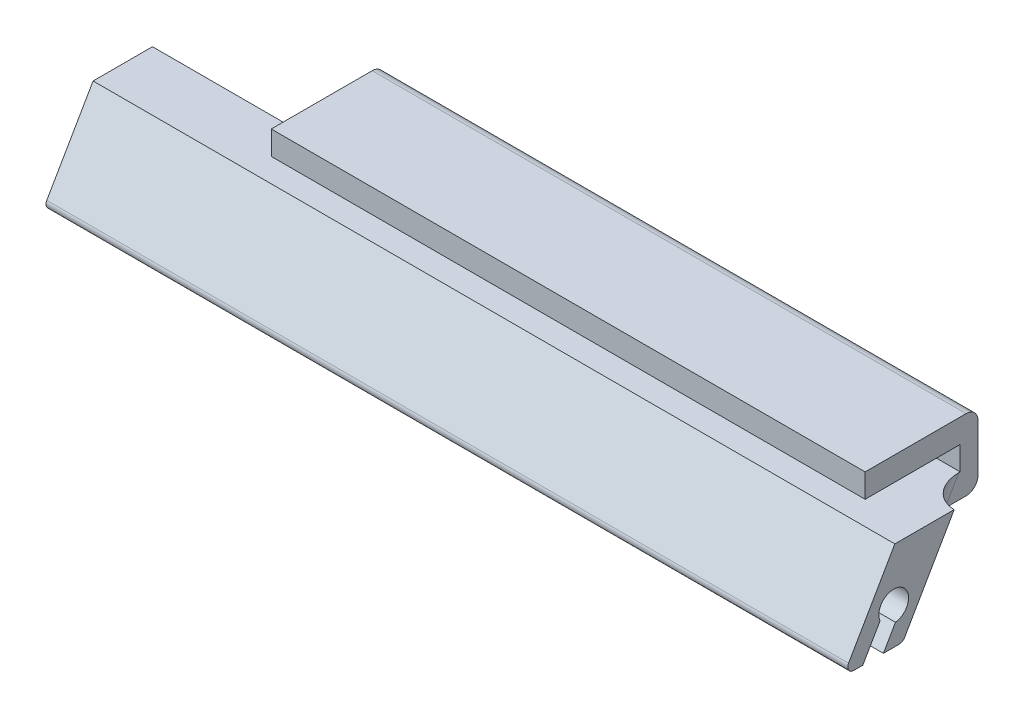
ISO-10303-21;
HEADER;
FILE_DESCRIPTION(('STEP AP214'),'2;1');
FILE_NAME('part.step','',(''),(''),'','','');
FILE_SCHEMA(('AUTOMOTIVE_DESIGN { 1 0 10303 214 1 1 1 1 }'));
ENDSEC;
DATA;
#1=APPLICATION_CONTEXT('core data for automotive mechanical design processes');
#2=APPLICATION_PROTOCOL_DEFINITION('international standard','automotive_design',2000,#1);
#3=PRODUCT_CONTEXT('',#1,'mechanical');
#4=PRODUCT('Part','Part','',(#3));
#5=PRODUCT_RELATED_PRODUCT_CATEGORY('part','',(#4));
#6=PRODUCT_DEFINITION_FORMATION('','',#4);
#7=PRODUCT_DEFINITION_CONTEXT('part definition',#1,'design');
#8=PRODUCT_DEFINITION('design','',#6,#7);
#9=PRODUCT_DEFINITION_SHAPE('','',#8);
#10=(LENGTH_UNIT() NAMED_UNIT(*) SI_UNIT(.MILLI.,.METRE.));
#11=(NAMED_UNIT(*) PLANE_ANGLE_UNIT() SI_UNIT($,.RADIAN.));
#12=(NAMED_UNIT(*) SI_UNIT($,.STERADIAN.) SOLID_ANGLE_UNIT());
#13=UNCERTAINTY_MEASURE_WITH_UNIT(LENGTH_MEASURE(1.E-05),#10,'distance_accuracy_value','');
#14=(GEOMETRIC_REPRESENTATION_CONTEXT(3) GLOBAL_UNCERTAINTY_ASSIGNED_CONTEXT((#13)) GLOBAL_UNIT_ASSIGNED_CONTEXT((#10,
#11,#12)) REPRESENTATION_CONTEXT('',''));
#15=CARTESIAN_POINT('',(0.,0.,0.));
#16=DIRECTION('',(0.,0.,1.));
#17=DIRECTION('',(1.,0.,0.));
#18=AXIS2_PLACEMENT_3D('',#15,#16,#17);
#19=CARTESIAN_POINT('',(100.,0.,0.));
#20=DIRECTION('',(1.,0.,0.));
#21=DIRECTION('',(0.,0.,-1.));
#22=AXIS2_PLACEMENT_3D('',#19,#20,#21);
#23=PLANE('',#22);
#24=DIRECTION('',(0.,1.,0.));
#25=VECTOR('',#24,1.);
#26=CARTESIAN_POINT('',(100.,0.,-27.6602540378444));
#27=LINE('',#26,#25);
#28=CARTESIAN_POINT('',(100.,13.,-27.6602540378444));
#29=VERTEX_POINT('',#28);
#30=CARTESIAN_POINT('',(100.,21.,-27.6602540378444));
#31=VERTEX_POINT('',#30);
#32=EDGE_CURVE('E339',#29,#31,#27,.T.);
#33=ORIENTED_EDGE('',*,*,#32,.T.);
#34=CARTESIAN_POINT('',(100.,21.,-25.6602540378444));
#35=DIRECTION('',(1.,0.,0.));
#36=DIRECTION('',(0.,0.,-1.));
#37=AXIS2_PLACEMENT_3D('',#34,#35,#36);
#38=CIRCLE('',#37,2.);
#39=CARTESIAN_POINT('',(100.,23.,-25.6602540378444));
#40=VERTEX_POINT('',#39);
#41=EDGE_CURVE('E250',#31,#40,#38,.T.);
#42=ORIENTED_EDGE('',*,*,#41,.T.);
#43=DIRECTION('',(0.,0.,1.));
#44=VECTOR('',#43,1.);
#45=CARTESIAN_POINT('',(100.,23.,0.));
#46=LINE('',#45,#44);
#47=CARTESIAN_POINT('',(100.,23.,-8.66025403784441));
#48=VERTEX_POINT('',#47);
#49=EDGE_CURVE('E343',#40,#48,#46,.T.);
#50=ORIENTED_EDGE('',*,*,#49,.T.);
#51=DIRECTION('',(0.,1.,0.));
#52=VECTOR('',#51,1.);
#53=CARTESIAN_POINT('',(100.,0.,-8.66025403784441));
#54=LINE('',#53,#52);
#55=CARTESIAN_POINT('',(100.,19.,-8.66025403784441));
#56=VERTEX_POINT('',#55);
#57=EDGE_CURVE('E319',#56,#48,#54,.T.);
#58=ORIENTED_EDGE('',*,*,#57,.F.);
#59=DIRECTION('',(0.,0.,1.));
#60=VECTOR('',#59,1.);
#61=CARTESIAN_POINT('',(100.,19.,0.));
#62=LINE('',#61,#60);
#63=CARTESIAN_POINT('',(100.,19.,-24.6602540378444));
#64=VERTEX_POINT('',#63);
#65=EDGE_CURVE('E323',#64,#56,#62,.T.);
#66=ORIENTED_EDGE('',*,*,#65,.F.);
#67=DIRECTION('',(0.,1.,0.));
#68=VECTOR('',#67,1.);
#69=CARTESIAN_POINT('',(100.,0.,-24.6602540378444));
#70=LINE('',#69,#68);
#71=CARTESIAN_POINT('',(100.,15.,-24.6602540378444));
#72=VERTEX_POINT('',#71);
#73=EDGE_CURVE('E328',#72,#64,#70,.T.);
#74=ORIENTED_EDGE('',*,*,#73,.F.);
#75=DIRECTION('',(0.,0.,-1.));
#76=VECTOR('',#75,1.);
#77=CARTESIAN_POINT('',(100.,15.,0.));
#78=LINE('',#77,#76);
#79=CARTESIAN_POINT('',(100.,15.,-24.4337567297407));
#80=VERTEX_POINT('',#79);
#81=EDGE_CURVE('E332',#80,#72,#78,.T.);
#82=ORIENTED_EDGE('',*,*,#81,.F.);
#83=DIRECTION('',(0.,-0.866025403784438,0.500000000000001));
#84=VECTOR('',#83,1.);
#85=CARTESIAN_POINT('',(100.,3.5,-17.79422863406));
#86=LINE('',#85,#84);
#87=CARTESIAN_POINT('',(100.,11.,-22.1243556529822));
#88=VERTEX_POINT('',#87);
#89=EDGE_CURVE('E214',#80,#88,#86,.T.);
#90=ORIENTED_EDGE('',*,*,#89,.T.);
#91=DIRECTION('',(0.,0.,-1.));
#92=VECTOR('',#91,1.);
#93=CARTESIAN_POINT('',(100.,11.,0.));
#94=LINE('',#93,#92);
#95=CARTESIAN_POINT('',(100.,11.,-25.6602540378444));
#96=VERTEX_POINT('',#95);
#97=EDGE_CURVE('E335',#88,#96,#94,.T.);
#98=ORIENTED_EDGE('',*,*,#97,.T.);
#99=CARTESIAN_POINT('',(100.,13.,-25.6602540378444));
#100=DIRECTION('',(1.,0.,0.));
#101=DIRECTION('',(0.,0.,-1.));
#102=AXIS2_PLACEMENT_3D('',#99,#100,#101);
#103=CIRCLE('',#102,2.);
#104=EDGE_CURVE('E247',#96,#29,#103,.T.);
#105=ORIENTED_EDGE('',*,*,#104,.T.);
#106=EDGE_LOOP('',(#33,#42,#50,#58,#66,#74,#82,#90,#98,#105));
#107=FACE_BOUND('',#106,.T.);
#108=ADVANCED_FACE('F44',(#107),#23,.T.);
#109=CARTESIAN_POINT('',(0.,0.,0.));
#110=DIRECTION('',(1.,0.,0.));
#111=DIRECTION('',(0.,0.,-1.));
#112=AXIS2_PLACEMENT_3D('',#109,#110,#111);
#113=PLANE('',#112);
#114=DIRECTION('',(0.,0.,1.));
#115=VECTOR('',#114,1.);
#116=CARTESIAN_POINT('',(0.,23.,0.));
#117=LINE('',#116,#115);
#118=CARTESIAN_POINT('',(0.,23.,-25.6602540378444));
#119=VERTEX_POINT('',#118);
#120=CARTESIAN_POINT('',(0.,23.,-8.66025403784441));
#121=VERTEX_POINT('',#120);
#122=EDGE_CURVE('E324',#119,#121,#117,.T.);
#123=ORIENTED_EDGE('',*,*,#122,.F.);
#124=CARTESIAN_POINT('',(0.,21.,-25.6602540378444));
#125=DIRECTION('',(1.,0.,0.));
#126=DIRECTION('',(0.,0.,-1.));
#127=AXIS2_PLACEMENT_3D('',#124,#125,#126);
#128=CIRCLE('',#127,2.);
#129=CARTESIAN_POINT('',(0.,21.,-27.6602540378444));
#130=VERTEX_POINT('',#129);
#131=EDGE_CURVE('E237',#119,#130,#128,.F.);
#132=ORIENTED_EDGE('',*,*,#131,.T.);
#133=DIRECTION('',(0.,1.,0.));
#134=VECTOR('',#133,1.);
#135=CARTESIAN_POINT('',(0.,0.,-27.6602540378444));
#136=LINE('',#135,#134);
#137=CARTESIAN_POINT('',(0.,13.,-27.6602540378444));
#138=VERTEX_POINT('',#137);
#139=EDGE_CURVE('E365',#138,#130,#136,.T.);
#140=ORIENTED_EDGE('',*,*,#139,.F.);
#141=CARTESIAN_POINT('',(0.,13.,-25.6602540378444));
#142=DIRECTION('',(1.,0.,0.));
#143=DIRECTION('',(0.,0.,-1.));
#144=AXIS2_PLACEMENT_3D('',#141,#142,#143);
#145=CIRCLE('',#144,2.);
#146=CARTESIAN_POINT('',(0.,11.,-25.6602540378444));
#147=VERTEX_POINT('',#146);
#148=EDGE_CURVE('E222',#138,#147,#145,.F.);
#149=ORIENTED_EDGE('',*,*,#148,.T.);
#150=DIRECTION('',(0.,0.,-1.));
#151=VECTOR('',#150,1.);
#152=CARTESIAN_POINT('',(0.,11.,0.));
#153=LINE('',#152,#151);
#154=CARTESIAN_POINT('',(0.,11.,-22.1243556529822));
#155=VERTEX_POINT('',#154);
#156=EDGE_CURVE('E361',#155,#147,#153,.T.);
#157=ORIENTED_EDGE('',*,*,#156,.F.);
#158=DIRECTION('',(0.,-0.866025403784438,0.500000000000001));
#159=VECTOR('',#158,1.);
#160=CARTESIAN_POINT('',(0.,-6.8301270189222,-11.8301270189222));
#161=LINE('',#160,#159);
#162=CARTESIAN_POINT('',(0.,15.,-24.4337567297407));
#163=VERTEX_POINT('',#162);
#164=EDGE_CURVE('E409',#155,#163,#161,.F.);
#165=ORIENTED_EDGE('',*,*,#164,.T.);
#166=DIRECTION('',(0.,0.,-1.));
#167=VECTOR('',#166,1.);
#168=CARTESIAN_POINT('',(0.,15.,0.));
#169=LINE('',#168,#167);
#170=CARTESIAN_POINT('',(0.,15.,-24.6602540378444));
#171=VERTEX_POINT('',#170);
#172=EDGE_CURVE('E358',#163,#171,#169,.T.);
#173=ORIENTED_EDGE('',*,*,#172,.T.);
#174=DIRECTION('',(0.,1.,0.));
#175=VECTOR('',#174,1.);
#176=CARTESIAN_POINT('',(0.,0.,-24.6602540378444));
#177=LINE('',#176,#175);
#178=CARTESIAN_POINT('',(0.,19.,-24.6602540378444));
#179=VERTEX_POINT('',#178);
#180=EDGE_CURVE('E354',#171,#179,#177,.T.);
#181=ORIENTED_EDGE('',*,*,#180,.T.);
#182=DIRECTION('',(0.,0.,1.));
#183=VECTOR('',#182,1.);
#184=CARTESIAN_POINT('',(0.,19.,0.));
#185=LINE('',#184,#183);
#186=CARTESIAN_POINT('',(0.,19.,-8.66025403784441));
#187=VERTEX_POINT('',#186);
#188=EDGE_CURVE('E350',#179,#187,#185,.T.);
#189=ORIENTED_EDGE('',*,*,#188,.T.);
#190=DIRECTION('',(0.,1.,0.));
#191=VECTOR('',#190,1.);
#192=CARTESIAN_POINT('',(0.,0.,-8.66025403784441));
#193=LINE('',#192,#191);
#194=EDGE_CURVE('E318',#187,#121,#193,.T.);
#195=ORIENTED_EDGE('',*,*,#194,.T.);
#196=EDGE_LOOP('',(#123,#132,#140,#149,#157,#165,#173,#181,#189,#195));
#197=FACE_BOUND('',#196,.T.);
#198=ADVANCED_FACE('F433',(#197),#113,.F.);
#199=CARTESIAN_POINT('',(100.,0.,-8.66025403784441));
#200=DIRECTION('',(0.,0.,1.));
#201=DIRECTION('',(1.,0.,0.));
#202=AXIS2_PLACEMENT_3D('',#199,#200,#201);
#203=PLANE('',#202);
#204=ORIENTED_EDGE('',*,*,#194,.F.);
#205=DIRECTION('',(-1.,0.,0.));
#206=VECTOR('',#205,1.);
#207=CARTESIAN_POINT('',(100.,19.,-8.66025403784441));
#208=LINE('',#207,#206);
#209=EDGE_CURVE('E395',#56,#187,#208,.T.);
#210=ORIENTED_EDGE('',*,*,#209,.F.);
#211=ORIENTED_EDGE('',*,*,#57,.T.);
#212=DIRECTION('',(-1.,0.,0.));
#213=VECTOR('',#212,1.);
#214=CARTESIAN_POINT('',(100.,23.,-8.66025403784441));
#215=LINE('',#214,#213);
#216=EDGE_CURVE('E346',#48,#121,#215,.T.);
#217=ORIENTED_EDGE('',*,*,#216,.T.);
#218=EDGE_LOOP('',(#204,#210,#211,#217));
#219=FACE_BOUND('',#218,.T.);
#220=ADVANCED_FACE('F428',(#219),#203,.T.);
#221=CARTESIAN_POINT('',(100.,19.,0.));
#222=DIRECTION('',(0.,-1.,0.));
#223=DIRECTION('',(0.,0.,-1.));
#224=AXIS2_PLACEMENT_3D('',#221,#222,#223);
#225=PLANE('',#224);
#226=ORIENTED_EDGE('',*,*,#188,.F.);
#227=DIRECTION('',(-1.,0.,0.));
#228=VECTOR('',#227,1.);
#229=CARTESIAN_POINT('',(100.,19.,-24.6602540378444));
#230=LINE('',#229,#228);
#231=EDGE_CURVE('E392',#64,#179,#230,.T.);
#232=ORIENTED_EDGE('',*,*,#231,.F.);
#233=ORIENTED_EDGE('',*,*,#65,.T.);
#234=ORIENTED_EDGE('',*,*,#209,.T.);
#235=EDGE_LOOP('',(#226,#232,#233,#234));
#236=FACE_BOUND('',#235,.T.);
#237=ADVANCED_FACE('F432',(#236),#225,.T.);
#238=CARTESIAN_POINT('',(100.,0.,-24.6602540378444));
#239=DIRECTION('',(0.,0.,1.));
#240=DIRECTION('',(1.,0.,0.));
#241=AXIS2_PLACEMENT_3D('',#238,#239,#240);
#242=PLANE('',#241);
#243=ORIENTED_EDGE('',*,*,#180,.F.);
#244=DIRECTION('',(-1.,0.,0.));
#245=VECTOR('',#244,1.);
#246=CARTESIAN_POINT('',(100.,15.,-24.6602540378444));
#247=LINE('',#246,#245);
#248=EDGE_CURVE('E388',#72,#171,#247,.T.);
#249=ORIENTED_EDGE('',*,*,#248,.F.);
#250=ORIENTED_EDGE('',*,*,#73,.T.);
#251=ORIENTED_EDGE('',*,*,#231,.T.);
#252=EDGE_LOOP('',(#243,#249,#250,#251));
#253=FACE_BOUND('',#252,.T.);
#254=ADVANCED_FACE('F437',(#253),#242,.T.);
#255=CARTESIAN_POINT('',(100.,15.,0.));
#256=DIRECTION('',(0.,1.,0.));
#257=DIRECTION('',(0.,0.,1.));
#258=AXIS2_PLACEMENT_3D('',#255,#256,#257);
#259=PLANE('',#258);
#260=DIRECTION('',(0.,0.,1.));
#261=VECTOR('',#260,1.);
#262=CARTESIAN_POINT('',(105.,15.,0.));
#263=LINE('',#262,#261);
#264=CARTESIAN_POINT('',(105.,15.,-18.6602540378444));
#265=VERTEX_POINT('',#264);
#266=CARTESIAN_POINT('',(105.,15.,-8.66025403784441));
#267=VERTEX_POINT('',#266);
#268=EDGE_CURVE('E190',#265,#267,#263,.T.);
#269=ORIENTED_EDGE('',*,*,#268,.F.);
#270=CARTESIAN_POINT('',(105.,15.,-24.4337567297407));
#271=DIRECTION('',(0.,1.,0.));
#272=DIRECTION('',(0.,0.,-1.));
#273=AXIS2_PLACEMENT_3D('',#270,#271,#272);
#274=ELLIPSE('',#273,5.77350269189626,5.);
#275=EDGE_CURVE('E194',#265,#80,#274,.F.);
#276=ORIENTED_EDGE('',*,*,#275,.T.);
#277=ORIENTED_EDGE('',*,*,#81,.T.);
#278=ORIENTED_EDGE('',*,*,#248,.T.);
#279=ORIENTED_EDGE('',*,*,#172,.F.);
#280=CARTESIAN_POINT('',(-5.,15.,-24.4337567297407));
#281=DIRECTION('',(0.,1.,0.));
#282=DIRECTION('',(0.,0.,1.));
#283=AXIS2_PLACEMENT_3D('',#280,#281,#282);
#284=ELLIPSE('',#283,5.77350269189626,5.);
#285=CARTESIAN_POINT('',(-5.,15.,-18.6602540378444));
#286=VERTEX_POINT('',#285);
#287=EDGE_CURVE('E225',#163,#286,#284,.F.);
#288=ORIENTED_EDGE('',*,*,#287,.T.);
#289=DIRECTION('',(1.,0.,0.));
#290=VECTOR('',#289,1.);
#291=CARTESIAN_POINT('',(-30.,15.,-18.6602540378444));
#292=LINE('',#291,#290);
#293=CARTESIAN_POINT('',(-30.,15.,-18.6602540378444));
#294=VERTEX_POINT('',#293);
#295=EDGE_CURVE('E314',#294,#286,#292,.T.);
#296=ORIENTED_EDGE('',*,*,#295,.F.);
#297=DIRECTION('',(0.,0.,1.));
#298=VECTOR('',#297,1.);
#299=CARTESIAN_POINT('',(-30.,15.,0.));
#300=LINE('',#299,#298);
#301=CARTESIAN_POINT('',(-30.,15.,-8.66025403784441));
#302=VERTEX_POINT('',#301);
#303=EDGE_CURVE('E299',#294,#302,#300,.T.);
#304=ORIENTED_EDGE('',*,*,#303,.T.);
#305=DIRECTION('',(-1.,0.,0.));
#306=VECTOR('',#305,1.);
#307=CARTESIAN_POINT('',(100.,15.,-8.66025403784441));
#308=LINE('',#307,#306);
#309=EDGE_CURVE('E197',#267,#302,#308,.T.);
#310=ORIENTED_EDGE('',*,*,#309,.F.);
#311=EDGE_LOOP('',(#269,#276,#277,#278,#279,#288,#296,#304,#310));
#312=FACE_BOUND('',#311,.T.);
#313=ADVANCED_FACE('F192',(#312),#259,.T.);
#314=CARTESIAN_POINT('',(100.,0.,0.));
#315=DIRECTION('',(0.,0.500000000000001,0.866025403784438));
#316=DIRECTION('',(0.,-0.866025403784438,0.500000000000001));
#317=AXIS2_PLACEMENT_3D('',#314,#315,#316);
#318=PLANE('',#317);
#319=DIRECTION('',(0.,-0.866025403784438,0.500000000000001));
#320=VECTOR('',#319,1.);
#321=CARTESIAN_POINT('',(-30.,0.,0.));
#322=LINE('',#321,#320);
#323=CARTESIAN_POINT('',(-30.,1.5,-0.866025403784441));
#324=VERTEX_POINT('',#323);
#325=EDGE_CURVE('E293',#302,#324,#322,.T.);
#326=ORIENTED_EDGE('',*,*,#325,.T.);
#327=DIRECTION('',(-1.,0.,0.));
#328=VECTOR('',#327,1.);
#329=CARTESIAN_POINT('',(100.,1.5,-0.866025403784441));
#330=LINE('',#329,#328);
#331=CARTESIAN_POINT('',(105.,1.5,-0.866025403784441));
#332=VERTEX_POINT('',#331);
#333=EDGE_CURVE('E11',#324,#332,#330,.F.);
#334=ORIENTED_EDGE('',*,*,#333,.T.);
#335=DIRECTION('',(0.,-0.866025403784438,0.500000000000001));
#336=VECTOR('',#335,1.);
#337=CARTESIAN_POINT('',(105.,0.,0.));
#338=LINE('',#337,#336);
#339=EDGE_CURVE('E199',#267,#332,#338,.T.);
#340=ORIENTED_EDGE('',*,*,#339,.F.);
#341=ORIENTED_EDGE('',*,*,#309,.T.);
#342=EDGE_LOOP('',(#326,#334,#340,#341));
#343=FACE_BOUND('',#342,.T.);
#344=ADVANCED_FACE('F444',(#343),#318,.T.);
#345=CARTESIAN_POINT('',(100.,0.,0.));
#346=DIRECTION('',(0.,-1.,0.));
#347=DIRECTION('',(0.,0.,-1.));
#348=AXIS2_PLACEMENT_3D('',#345,#346,#347);
#349=PLANE('',#348);
#350=DIRECTION('',(0.,0.,-1.));
#351=VECTOR('',#350,1.);
#352=CARTESIAN_POINT('',(105.,0.,0.));
#353=LINE('',#352,#351);
#354=CARTESIAN_POINT('',(105.,0.,-1.73205080756888));
#355=VERTEX_POINT('',#354);
#356=CARTESIAN_POINT('',(105.,0.,-3.26794919243112));
#357=VERTEX_POINT('',#356);
#358=EDGE_CURVE('E282',#355,#357,#353,.T.);
#359=ORIENTED_EDGE('',*,*,#358,.F.);
#360=DIRECTION('',(-1.,0.,0.));
#361=VECTOR('',#360,1.);
#362=CARTESIAN_POINT('',(100.,0.,-1.73205080756888));
#363=LINE('',#362,#361);
#364=CARTESIAN_POINT('',(-30.,0.,-1.73205080756888));
#365=VERTEX_POINT('',#364);
#366=EDGE_CURVE('E53',#355,#365,#363,.T.);
#367=ORIENTED_EDGE('',*,*,#366,.T.);
#368=DIRECTION('',(0.,0.,-1.));
#369=VECTOR('',#368,1.);
#370=CARTESIAN_POINT('',(-30.,0.,0.));
#371=LINE('',#370,#369);
#372=CARTESIAN_POINT('',(-30.,0.,-3.26794919243112));
#373=VERTEX_POINT('',#372);
#374=EDGE_CURVE('E280',#365,#373,#371,.T.);
#375=ORIENTED_EDGE('',*,*,#374,.T.);
#376=DIRECTION('',(-1.,0.,0.));
#377=VECTOR('',#376,1.);
#378=CARTESIAN_POINT('',(100.,0.,-3.26794919243112));
#379=LINE('',#378,#377);
#380=EDGE_CURVE('E383',#357,#373,#379,.T.);
#381=ORIENTED_EDGE('',*,*,#380,.F.);
#382=EDGE_LOOP('',(#359,#367,#375,#381));
#383=FACE_BOUND('',#382,.T.);
#384=ADVANCED_FACE('F278',(#383),#349,.T.);
#385=CARTESIAN_POINT('',(100.,-1.4150635094611,-2.45096189432334));
#386=DIRECTION('',(0.,0.500000000000001,0.866025403784438));
#387=DIRECTION('',(0.,-0.866025403784438,0.500000000000001));
#388=AXIS2_PLACEMENT_3D('',#385,#386,#387);
#389=PLANE('',#388);
#390=ORIENTED_EDGE('',*,*,#380,.T.);
#391=DIRECTION('',(0.,0.866025403784438,-0.500000000000001));
#392=VECTOR('',#391,1.);
#393=CARTESIAN_POINT('',(-30.,-1.4150635094611,-2.45096189432334));
#394=LINE('',#393,#392);
#395=CARTESIAN_POINT('',(-30.,5.01794919243113,-6.1650635094611));
#396=VERTEX_POINT('',#395);
#397=EDGE_CURVE('E291',#373,#396,#394,.T.);
#398=ORIENTED_EDGE('',*,*,#397,.T.);
#399=DIRECTION('',(-1.,0.,0.));
#400=VECTOR('',#399,1.);
#401=CARTESIAN_POINT('',(100.,5.01794919243113,-6.1650635094611));
#402=LINE('',#401,#400);
#403=CARTESIAN_POINT('',(105.,5.01794919243113,-6.1650635094611));
#404=VERTEX_POINT('',#403);
#405=EDGE_CURVE('E380',#404,#396,#402,.T.);
#406=ORIENTED_EDGE('',*,*,#405,.F.);
#407=DIRECTION('',(0.,0.866025403784438,-0.500000000000001));
#408=VECTOR('',#407,1.);
#409=CARTESIAN_POINT('',(105.,-1.4150635094611,-2.45096189432334));
#410=LINE('',#409,#408);
#411=EDGE_CURVE('E817',#357,#404,#410,.T.);
#412=ORIENTED_EDGE('',*,*,#411,.F.);
#413=EDGE_LOOP('',(#390,#398,#406,#412));
#414=FACE_BOUND('',#413,.T.);
#415=ADVANCED_FACE('F447',(#414),#389,.F.);
#416=CARTESIAN_POINT('',(100.,6.,-8.46410161513776));
#417=DIRECTION('',(-1.,0.,0.));
#418=DIRECTION('',(0.,0.,1.));
#419=AXIS2_PLACEMENT_3D('',#416,#417,#418);
#420=CYLINDRICAL_SURFACE('',#419,2.5);
#421=ORIENTED_EDGE('',*,*,#405,.T.);
#422=CARTESIAN_POINT('',(-30.,6.,-8.46410161513776));
#423=DIRECTION('',(1.,0.,0.));
#424=DIRECTION('',(0.,0.,-1.));
#425=AXIS2_PLACEMENT_3D('',#422,#423,#424);
#426=CIRCLE('',#425,2.5);
#427=CARTESIAN_POINT('',(-30.,3.51794919243112,-8.76313972081442));
#428=VERTEX_POINT('',#427);
#429=EDGE_CURVE('E297',#396,#428,#426,.F.);
#430=ORIENTED_EDGE('',*,*,#429,.T.);
#431=DIRECTION('',(-1.,0.,0.));
#432=VECTOR('',#431,1.);
#433=CARTESIAN_POINT('',(100.,3.51794919243112,-8.76313972081442));
#434=LINE('',#433,#432);
#435=CARTESIAN_POINT('',(105.,3.51794919243112,-8.76313972081442));
#436=VERTEX_POINT('',#435);
#437=EDGE_CURVE('E377',#436,#428,#434,.T.);
#438=ORIENTED_EDGE('',*,*,#437,.F.);
#439=CARTESIAN_POINT('',(105.,6.,-8.46410161513776));
#440=DIRECTION('',(1.,0.,0.));
#441=DIRECTION('',(0.,0.,-1.));
#442=AXIS2_PLACEMENT_3D('',#439,#440,#441);
#443=CIRCLE('',#442,2.5);
#444=EDGE_CURVE('E821',#404,#436,#443,.F.);
#445=ORIENTED_EDGE('',*,*,#444,.F.);
#446=EDGE_LOOP('',(#421,#430,#438,#445));
#447=FACE_BOUND('',#446,.T.);
#448=ADVANCED_FACE('F450',(#447),#420,.F.);
#449=CARTESIAN_POINT('',(100.,-2.9150635094611,-5.04903810567665));
#450=DIRECTION('',(0.,-0.500000000000001,-0.866025403784438));
#451=DIRECTION('',(0.,0.866025403784438,-0.500000000000001));
#452=AXIS2_PLACEMENT_3D('',#449,#450,#451);
#453=PLANE('',#452);
#454=ORIENTED_EDGE('',*,*,#437,.T.);
#455=DIRECTION('',(0.,-0.866025403784438,0.500000000000001));
#456=VECTOR('',#455,1.);
#457=CARTESIAN_POINT('',(-30.,-2.9150635094611,-5.04903810567665));
#458=LINE('',#457,#456);
#459=CARTESIAN_POINT('',(-30.,0.,-6.73205080756888));
#460=VERTEX_POINT('',#459);
#461=EDGE_CURVE('E306',#428,#460,#458,.T.);
#462=ORIENTED_EDGE('',*,*,#461,.T.);
#463=DIRECTION('',(-1.,0.,0.));
#464=VECTOR('',#463,1.);
#465=CARTESIAN_POINT('',(100.,0.,-6.73205080756888));
#466=LINE('',#465,#464);
#467=CARTESIAN_POINT('',(105.,0.,-6.73205080756888));
#468=VERTEX_POINT('',#467);
#469=EDGE_CURVE('E374',#468,#460,#466,.T.);
#470=ORIENTED_EDGE('',*,*,#469,.F.);
#471=DIRECTION('',(0.,-0.866025403784438,0.500000000000001));
#472=VECTOR('',#471,1.);
#473=CARTESIAN_POINT('',(105.,-2.9150635094611,-5.04903810567665));
#474=LINE('',#473,#472);
#475=EDGE_CURVE('E825',#436,#468,#474,.T.);
#476=ORIENTED_EDGE('',*,*,#475,.F.);
#477=EDGE_LOOP('',(#454,#462,#470,#476));
#478=FACE_BOUND('',#477,.T.);
#479=ADVANCED_FACE('F454',(#478),#453,.F.);
#480=DIRECTION('',(0.,0.,-1.));
#481=VECTOR('',#480,1.);
#482=CARTESIAN_POINT('',(-30.,0.,0.));
#483=LINE('',#482,#481);
#484=CARTESIAN_POINT('',(-30.,0.,-9.42264973081038));
#485=VERTEX_POINT('',#484);
#486=EDGE_CURVE('E310',#460,#485,#483,.T.);
#487=ORIENTED_EDGE('',*,*,#486,.T.);
#488=DIRECTION('',(-1.,0.,0.));
#489=VECTOR('',#488,1.);
#490=CARTESIAN_POINT('',(100.,0.,-9.42264973081038));
#491=LINE('',#490,#489);
#492=CARTESIAN_POINT('',(105.,0.,-9.42264973081038));
#493=VERTEX_POINT('',#492);
#494=EDGE_CURVE('E266',#485,#493,#491,.F.);
#495=ORIENTED_EDGE('',*,*,#494,.T.);
#496=DIRECTION('',(0.,0.,-1.));
#497=VECTOR('',#496,1.);
#498=CARTESIAN_POINT('',(105.,0.,0.));
#499=LINE('',#498,#497);
#500=EDGE_CURVE('E809',#468,#493,#499,.T.);
#501=ORIENTED_EDGE('',*,*,#500,.F.);
#502=ORIENTED_EDGE('',*,*,#469,.T.);
#503=EDGE_LOOP('',(#487,#495,#501,#502));
#504=FACE_BOUND('',#503,.T.);
#505=ADVANCED_FACE('F458',(#504),#349,.T.);
#506=CARTESIAN_POINT('',(100.,-4.3301270189222,-7.49999999999999));
#507=DIRECTION('',(0.,-0.500000000000001,-0.866025403784438));
#508=DIRECTION('',(0.,0.866025403784438,-0.500000000000001));
#509=AXIS2_PLACEMENT_3D('',#506,#507,#508);
#510=PLANE('',#509);
#511=DIRECTION('',(0.,-0.866025403784438,0.500000000000001));
#512=VECTOR('',#511,1.);
#513=CARTESIAN_POINT('',(105.,-4.3301270189222,-7.5));
#514=LINE('',#513,#512);
#515=CARTESIAN_POINT('',(105.,6.00000000000001,-13.4641016151378));
#516=VERTEX_POINT('',#515);
#517=CARTESIAN_POINT('',(105.,0.499999999999999,-10.2886751345948));
#518=VERTEX_POINT('',#517);
#519=EDGE_CURVE('E207',#516,#518,#514,.T.);
#520=ORIENTED_EDGE('',*,*,#519,.T.);
#521=DIRECTION('',(-1.,0.,0.));
#522=VECTOR('',#521,1.);
#523=CARTESIAN_POINT('',(100.,0.499999999999999,-10.2886751345948));
#524=LINE('',#523,#522);
#525=CARTESIAN_POINT('',(-30.,0.499999999999999,-10.2886751345948));
#526=VERTEX_POINT('',#525);
#527=EDGE_CURVE('E256',#518,#526,#524,.T.);
#528=ORIENTED_EDGE('',*,*,#527,.T.);
#529=DIRECTION('',(0.,-0.866025403784438,0.500000000000001));
#530=VECTOR('',#529,1.);
#531=CARTESIAN_POINT('',(-30.,-4.3301270189222,-7.5));
#532=LINE('',#531,#530);
#533=EDGE_CURVE('E830',#294,#526,#532,.T.);
#534=ORIENTED_EDGE('',*,*,#533,.F.);
#535=ORIENTED_EDGE('',*,*,#295,.T.);
#536=DIRECTION('',(0.,-0.866025403784438,0.500000000000001));
#537=VECTOR('',#536,1.);
#538=CARTESIAN_POINT('',(-5.,-4.3301270189222,-7.49999999999999));
#539=LINE('',#538,#537);
#540=CARTESIAN_POINT('',(-5.,6.00000000000001,-13.4641016151378));
#541=VERTEX_POINT('',#540);
#542=EDGE_CURVE('E405',#286,#541,#539,.T.);
#543=ORIENTED_EDGE('',*,*,#542,.T.);
#544=DIRECTION('',(-1.,0.,0.));
#545=VECTOR('',#544,1.);
#546=CARTESIAN_POINT('',(100.,6.00000000000001,-13.4641016151378));
#547=LINE('',#546,#545);
#548=EDGE_CURVE('E402',#541,#516,#547,.F.);
#549=ORIENTED_EDGE('',*,*,#548,.T.);
#550=EDGE_LOOP('',(#520,#528,#534,#535,#543,#549));
#551=FACE_BOUND('',#550,.T.);
#552=ADVANCED_FACE('F462',(#551),#510,.T.);
#553=CARTESIAN_POINT('',(100.,11.,0.));
#554=DIRECTION('',(0.,1.,0.));
#555=DIRECTION('',(0.,0.,1.));
#556=AXIS2_PLACEMENT_3D('',#553,#554,#555);
#557=PLANE('',#556);
#558=ORIENTED_EDGE('',*,*,#156,.T.);
#559=DIRECTION('',(-1.,0.,0.));
#560=VECTOR('',#559,1.);
#561=CARTESIAN_POINT('',(100.,11.,-25.6602540378444));
#562=LINE('',#561,#560);
#563=EDGE_CURVE('E253',#147,#96,#562,.F.);
#564=ORIENTED_EDGE('',*,*,#563,.T.);
#565=ORIENTED_EDGE('',*,*,#97,.F.);
#566=DIRECTION('',(-1.,0.,0.));
#567=VECTOR('',#566,1.);
#568=CARTESIAN_POINT('',(100.,11.,-22.1243556529822));
#569=LINE('',#568,#567);
#570=EDGE_CURVE('E398',#88,#155,#569,.T.);
#571=ORIENTED_EDGE('',*,*,#570,.T.);
#572=EDGE_LOOP('',(#558,#564,#565,#571));
#573=FACE_BOUND('',#572,.T.);
#574=ADVANCED_FACE('F466',(#573),#557,.F.);
#575=CARTESIAN_POINT('',(100.,0.,-27.6602540378444));
#576=DIRECTION('',(0.,0.,1.));
#577=DIRECTION('',(1.,0.,0.));
#578=AXIS2_PLACEMENT_3D('',#575,#576,#577);
#579=PLANE('',#578);
#580=ORIENTED_EDGE('',*,*,#139,.T.);
#581=DIRECTION('',(-1.,0.,0.));
#582=VECTOR('',#581,1.);
#583=CARTESIAN_POINT('',(100.,21.,-27.6602540378444));
#584=LINE('',#583,#582);
#585=EDGE_CURVE('E244',#130,#31,#584,.F.);
#586=ORIENTED_EDGE('',*,*,#585,.T.);
#587=ORIENTED_EDGE('',*,*,#32,.F.);
#588=DIRECTION('',(-1.,0.,0.));
#589=VECTOR('',#588,1.);
#590=CARTESIAN_POINT('',(100.,13.,-27.6602540378444));
#591=LINE('',#590,#589);
#592=EDGE_CURVE('E240',#29,#138,#591,.T.);
#593=ORIENTED_EDGE('',*,*,#592,.T.);
#594=EDGE_LOOP('',(#580,#586,#587,#593));
#595=FACE_BOUND('',#594,.T.);
#596=ADVANCED_FACE('F470',(#595),#579,.F.);
#597=CARTESIAN_POINT('',(100.,23.,0.));
#598=DIRECTION('',(0.,-1.,0.));
#599=DIRECTION('',(0.,0.,-1.));
#600=AXIS2_PLACEMENT_3D('',#597,#598,#599);
#601=PLANE('',#600);
#602=ORIENTED_EDGE('',*,*,#49,.F.);
#603=DIRECTION('',(-1.,0.,0.));
#604=VECTOR('',#603,1.);
#605=CARTESIAN_POINT('',(100.,23.,-25.6602540378444));
#606=LINE('',#605,#604);
#607=EDGE_CURVE('E216',#40,#119,#606,.T.);
#608=ORIENTED_EDGE('',*,*,#607,.T.);
#609=ORIENTED_EDGE('',*,*,#122,.T.);
#610=ORIENTED_EDGE('',*,*,#216,.F.);
#611=EDGE_LOOP('',(#602,#608,#609,#610));
#612=FACE_BOUND('',#611,.T.);
#613=ADVANCED_FACE('F474',(#612),#601,.F.);
#614=CARTESIAN_POINT('',(-30.,0.,0.));
#615=DIRECTION('',(1.,0.,0.));
#616=DIRECTION('',(0.,0.,-1.));
#617=AXIS2_PLACEMENT_3D('',#614,#615,#616);
#618=PLANE('',#617);
#619=ORIENTED_EDGE('',*,*,#533,.T.);
#620=CARTESIAN_POINT('',(-30.,1.,-9.42264973081038));
#621=DIRECTION('',(1.,0.,0.));
#622=DIRECTION('',(0.,0.,-1.));
#623=AXIS2_PLACEMENT_3D('',#620,#621,#622);
#624=CIRCLE('',#623,1.);
#625=EDGE_CURVE('E263',#526,#485,#624,.F.);
#626=ORIENTED_EDGE('',*,*,#625,.T.);
#627=ORIENTED_EDGE('',*,*,#486,.F.);
#628=ORIENTED_EDGE('',*,*,#461,.F.);
#629=ORIENTED_EDGE('',*,*,#429,.F.);
#630=ORIENTED_EDGE('',*,*,#397,.F.);
#631=ORIENTED_EDGE('',*,*,#374,.F.);
#632=CARTESIAN_POINT('',(-30.,1.,-1.73205080756888));
#633=DIRECTION('',(1.,0.,0.));
#634=DIRECTION('',(0.,0.,-1.));
#635=AXIS2_PLACEMENT_3D('',#632,#633,#634);
#636=CIRCLE('',#635,1.);
#637=EDGE_CURVE('E260',#365,#324,#636,.F.);
#638=ORIENTED_EDGE('',*,*,#637,.T.);
#639=ORIENTED_EDGE('',*,*,#325,.F.);
#640=ORIENTED_EDGE('',*,*,#303,.F.);
#641=EDGE_LOOP('',(#619,#626,#627,#628,#629,#630,#631,#638,#639,#640));
#642=FACE_BOUND('',#641,.T.);
#643=ADVANCED_FACE('F287',(#642),#618,.F.);
#644=CARTESIAN_POINT('',(105.,0.,0.));
#645=DIRECTION('',(1.,0.,0.));
#646=DIRECTION('',(0.,0.,-1.));
#647=AXIS2_PLACEMENT_3D('',#644,#645,#646);
#648=PLANE('',#647);
#649=ORIENTED_EDGE('',*,*,#500,.T.);
#650=CARTESIAN_POINT('',(105.,1.,-9.42264973081038));
#651=DIRECTION('',(1.,0.,0.));
#652=DIRECTION('',(0.,0.,-1.));
#653=AXIS2_PLACEMENT_3D('',#650,#651,#652);
#654=CIRCLE('',#653,1.);
#655=EDGE_CURVE('E271',#493,#518,#654,.T.);
#656=ORIENTED_EDGE('',*,*,#655,.T.);
#657=ORIENTED_EDGE('',*,*,#519,.F.);
#658=EDGE_CURVE('E200',#265,#516,#514,.T.);
#659=ORIENTED_EDGE('',*,*,#658,.F.);
#660=ORIENTED_EDGE('',*,*,#268,.T.);
#661=ORIENTED_EDGE('',*,*,#339,.T.);
#662=CARTESIAN_POINT('',(105.,1.,-1.73205080756888));
#663=DIRECTION('',(1.,0.,0.));
#664=DIRECTION('',(0.,0.,-1.));
#665=AXIS2_PLACEMENT_3D('',#662,#663,#664);
#666=CIRCLE('',#665,1.);
#667=EDGE_CURVE('E60',#332,#355,#666,.T.);
#668=ORIENTED_EDGE('',*,*,#667,.T.);
#669=ORIENTED_EDGE('',*,*,#358,.T.);
#670=ORIENTED_EDGE('',*,*,#411,.T.);
#671=ORIENTED_EDGE('',*,*,#444,.T.);
#672=ORIENTED_EDGE('',*,*,#475,.T.);
#673=EDGE_LOOP('',(#649,#656,#657,#659,#660,#661,#668,#669,#670,#671,#672));
#674=FACE_BOUND('',#673,.T.);
#675=ADVANCED_FACE('F205',(#674),#648,.T.);
#676=CARTESIAN_POINT('',(100.,0.999999999999999,-22.1243556529822));
#677=DIRECTION('',(-1.,0.,0.));
#678=DIRECTION('',(0.,0.,1.));
#679=AXIS2_PLACEMENT_3D('',#676,#677,#678);
#680=CYLINDRICAL_SURFACE('',#679,10.);
#681=ORIENTED_EDGE('',*,*,#570,.F.);
#682=CARTESIAN_POINT('',(100.,11.,-22.1243556529822));
#683=CARTESIAN_POINT('',(100.000000282901,11.0000031308055,-22.0162661694948));
#684=CARTESIAN_POINT('',(100.002628874551,10.9982469704116,-21.9082098235119));
#685=CARTESIAN_POINT('',(100.012837252933,10.991251972733,-21.6924798696288));
#686=CARTESIAN_POINT('',(100.020415306689,10.9860143544139,-21.5848061410236));
#687=CARTESIAN_POINT('',(100.050064355012,10.9651695256607,-21.2633096902429));
#688=CARTESIAN_POINT('',(100.079053652133,10.9444299190459,-21.0504148686306));
#689=CARTESIAN_POINT('',(100.152561857671,10.8902448629834,-20.6320379205095));
#690=CARTESIAN_POINT('',(100.19686998154,10.8569713483008,-20.426494959991));
#691=CARTESIAN_POINT('',(100.298927164585,10.7784725453272,-20.0209871857878));
#692=CARTESIAN_POINT('',(100.356686112509,10.7332384605613,-19.8210265978516));
#693=CARTESIAN_POINT('',(100.495735220903,10.6220247127563,-19.3902965481174));
#694=CARTESIAN_POINT('',(100.579411379536,10.5537359668169,-19.1608967301129));
#695=CARTESIAN_POINT('',(100.760113724236,10.4028876448945,-18.7123599845333));
#696=CARTESIAN_POINT('',(100.857140195965,10.3203277635374,-18.4932232766962));
#697=CARTESIAN_POINT('',(101.062741555271,10.1417430758867,-18.0644580588757));
#698=CARTESIAN_POINT('',(101.171378189803,10.045645312951,-17.8548898025576));
#699=CARTESIAN_POINT('',(101.397761702204,9.84150158532078,-17.4467562946261));
#700=CARTESIAN_POINT('',(101.515511234359,9.73345213553168,-17.2481942778875));
#701=CARTESIAN_POINT('',(101.807669220495,9.46043093731003,-16.7839312919994));
#702=CARTESIAN_POINT('',(101.98570315104,9.29013441212426,-16.5236263761559));
#703=CARTESIAN_POINT('',(102.352700073592,8.93035192358367,-16.0248360830575));
#704=CARTESIAN_POINT('',(102.541667924064,8.7408574011168,-15.7863605290563));
#705=CARTESIAN_POINT('',(102.927209721376,8.34493383875717,-15.3315129172181));
#706=CARTESIAN_POINT('',(103.123771783462,8.13853073500036,-15.1151081087559));
#707=CARTESIAN_POINT('',(103.522227405755,7.71015983552556,-14.7039888744973));
#708=CARTESIAN_POINT('',(103.724118630751,7.48819878888598,-14.5092651371293));
#709=CARTESIAN_POINT('',(104.102915797406,7.0617077270226,-14.1669862133871));
#710=CARTESIAN_POINT('',(104.279400800988,6.85903356862455,-14.0166353314582));
#711=CARTESIAN_POINT('',(104.633420937705,6.44383479421837,-13.7322224334062));
#712=CARTESIAN_POINT('',(104.810954765889,6.23132080059683,-13.5981433927688));
#713=CARTESIAN_POINT('',(104.992302017079,6.00942584242756,-13.4695487613623));
#714=CARTESIAN_POINT('',(104.996151020237,6.00471401772075,-13.4668232562362));
#715=CARTESIAN_POINT('',(105.,6.00000000000001,-13.4641016151378));
#716=B_SPLINE_CURVE_WITH_KNOTS('',3,(#682,#683,#684,#685,#686,#687,#688,#689,#690,#691,#692,
#693,#694,#695,#696,#697,#698,#699,#700,#701,#702,#703,#704,#705,#706,#707,#708,#709,#710,#711,
#712,#713,#714,#715),.UNSPECIFIED.,.F.,.F.,(4,2,2,2,2,2,2,2,2,2,2,2,2,2,2,2,4),(0.,
0.324164501699099,0.648215563169865,1.29453690515195,1.9322973539421,2.57052815854178,
3.33008992767277,4.08966795194092,4.85350822338378,5.61757181965429,6.69122947966717,
7.7653679365688,8.83788855857105,9.90994676377595,10.8332249647611,11.7555286965104,
11.7755287009549),.UNSPECIFIED.);
#717=EDGE_CURVE('E217',#88,#516,#716,.T.);
#718=ORIENTED_EDGE('',*,*,#717,.T.);
#719=ORIENTED_EDGE('',*,*,#548,.F.);
#720=CARTESIAN_POINT('',(0.,11.,-22.1243556529822));
#721=CARTESIAN_POINT('',(-2.82900780644514E-07,11.0000031308055,-22.0162661694948));
#722=CARTESIAN_POINT('',(-0.00262887455136568,10.9982469704116,-21.9082098235119));
#723=CARTESIAN_POINT('',(-0.0128372529330048,10.991251972733,-21.6924798696287));
#724=CARTESIAN_POINT('',(-0.0204153066888338,10.9860143544139,-21.5848061410235));
#725=CARTESIAN_POINT('',(-0.0500643550123042,10.9651695256607,-21.2633096902428));
#726=CARTESIAN_POINT('',(-0.0790536521328331,10.9444299190459,-21.0504148686306));
#727=CARTESIAN_POINT('',(-0.152561857671331,10.8902448629834,-20.6320379205094));
#728=CARTESIAN_POINT('',(-0.196869981539882,10.8569713483008,-20.4264949599909));
#729=CARTESIAN_POINT('',(-0.298927164585147,10.7784725453272,-20.0209871857878));
#730=CARTESIAN_POINT('',(-0.356686112509031,10.7332384605613,-19.8210265978516));
#731=CARTESIAN_POINT('',(-0.495735220903313,10.6220247127563,-19.3902965481174));
#732=CARTESIAN_POINT('',(-0.579411379535753,10.5537359668169,-19.1608967301129));
#733=CARTESIAN_POINT('',(-0.760113724235806,10.4028876448945,-18.7123599845334));
#734=CARTESIAN_POINT('',(-0.85714019596474,10.3203277635375,-18.4932232766962));
#735=CARTESIAN_POINT('',(-1.06274155527061,10.1417430758867,-18.0644580588758));
#736=CARTESIAN_POINT('',(-1.17137818980308,10.045645312951,-17.8548898025576));
#737=CARTESIAN_POINT('',(-1.39776170220444,9.84150158532078,-17.4467562946261));
#738=CARTESIAN_POINT('',(-1.51551123435893,9.73345213553168,-17.2481942778875));
#739=CARTESIAN_POINT('',(-1.80766922049535,9.46043093731002,-16.7839312919994));
#740=CARTESIAN_POINT('',(-1.9857031510398,9.29013441212425,-16.5236263761559));
#741=CARTESIAN_POINT('',(-2.35270007359213,8.93035192358365,-16.0248360830574));
#742=CARTESIAN_POINT('',(-2.54166792406378,8.74085740111679,-15.7863605290563));
#743=CARTESIAN_POINT('',(-2.92720972137605,8.34493383875713,-15.3315129172181));
#744=CARTESIAN_POINT('',(-3.12377178346154,8.13853073500029,-15.1151081087559));
#745=CARTESIAN_POINT('',(-3.52222740575494,7.71015983552559,-14.7039888744973));
#746=CARTESIAN_POINT('',(-3.72411863075087,7.48819878888614,-14.5092651371294));
#747=CARTESIAN_POINT('',(-4.10291579740601,7.06170772702246,-14.166986213387));
#748=CARTESIAN_POINT('',(-4.27940080098749,6.85903356862406,-14.0166353314579));
#749=CARTESIAN_POINT('',(-4.63342093770629,6.4438347942189,-13.7322224334065));
#750=CARTESIAN_POINT('',(-4.81095476589185,6.23132080059874,-13.5981433927699));
#751=CARTESIAN_POINT('',(-4.99230201707892,6.00942584242764,-13.4695487613624));
#752=CARTESIAN_POINT('',(-4.99615102023722,6.00471401772079,-13.4668232562362));
#753=CARTESIAN_POINT('',(-5.,6.00000000000001,-13.4641016151378));
#754=B_SPLINE_CURVE_WITH_KNOTS('',3,(#720,#721,#722,#723,#724,#725,#726,#727,#728,#729,#730,
#731,#732,#733,#734,#735,#736,#737,#738,#739,#740,#741,#742,#743,#744,#745,#746,#747,#748,#749,
#750,#751,#752,#753),.UNSPECIFIED.,.F.,.F.,(4,2,2,2,2,2,2,2,2,2,2,2,2,2,2,2,4),(0.,
0.324164501699119,0.648215563169904,1.29453690515204,1.93229735394214,2.57052815854178,
3.33008992767275,4.08966795194088,4.85350822338376,5.6175718196543,6.69122947966721,
7.76536793656886,8.83788855857108,9.90994676377595,10.8332249647611,11.7555286965104,
11.7755287009549),.UNSPECIFIED.);
#755=EDGE_CURVE('E414',#541,#155,#754,.F.);
#756=ORIENTED_EDGE('',*,*,#755,.T.);
#757=EDGE_LOOP('',(#681,#718,#719,#756));
#758=FACE_BOUND('',#757,.T.);
#759=ADVANCED_FACE('F423',(#758),#680,.F.);
#760=CARTESIAN_POINT('',(-5.,-6.8301270189222,-11.8301270189222));
#761=DIRECTION('',(0.,-0.866025403784438,0.500000000000001));
#762=DIRECTION('',(0.,-0.500000000000001,-0.866025403784438));
#763=AXIS2_PLACEMENT_3D('',#760,#761,#762);
#764=CYLINDRICAL_SURFACE('',#763,5.);
#765=ORIENTED_EDGE('',*,*,#287,.F.);
#766=ORIENTED_EDGE('',*,*,#164,.F.);
#767=ORIENTED_EDGE('',*,*,#755,.F.);
#768=ORIENTED_EDGE('',*,*,#542,.F.);
#769=EDGE_LOOP('',(#765,#766,#767,#768));
#770=FACE_BOUND('',#769,.T.);
#771=ADVANCED_FACE('F421',(#770),#764,.F.);
#772=CARTESIAN_POINT('',(105.,-6.8301270189222,-11.8301270189222));
#773=DIRECTION('',(0.,0.866025403784438,-0.500000000000001));
#774=DIRECTION('',(0.,0.500000000000001,0.866025403784438));
#775=AXIS2_PLACEMENT_3D('',#772,#773,#774);
#776=CYLINDRICAL_SURFACE('',#775,5.);
#777=ORIENTED_EDGE('',*,*,#275,.F.);
#778=ORIENTED_EDGE('',*,*,#658,.T.);
#779=ORIENTED_EDGE('',*,*,#717,.F.);
#780=ORIENTED_EDGE('',*,*,#89,.F.);
#781=EDGE_LOOP('',(#777,#778,#779,#780));
#782=FACE_BOUND('',#781,.T.);
#783=ADVANCED_FACE('F212',(#782),#776,.F.);
#784=CARTESIAN_POINT('',(100.,21.,-25.6602540378444));
#785=DIRECTION('',(-1.,0.,0.));
#786=DIRECTION('',(0.,0.,1.));
#787=AXIS2_PLACEMENT_3D('',#784,#785,#786);
#788=CYLINDRICAL_SURFACE('',#787,2.);
#789=ORIENTED_EDGE('',*,*,#41,.F.);
#790=ORIENTED_EDGE('',*,*,#585,.F.);
#791=ORIENTED_EDGE('',*,*,#131,.F.);
#792=ORIENTED_EDGE('',*,*,#607,.F.);
#793=EDGE_LOOP('',(#789,#790,#791,#792));
#794=FACE_BOUND('',#793,.T.);
#795=ADVANCED_FACE('F510',(#794),#788,.T.);
#796=CARTESIAN_POINT('',(100.,13.,-25.6602540378444));
#797=DIRECTION('',(-1.,0.,0.));
#798=DIRECTION('',(0.,0.,1.));
#799=AXIS2_PLACEMENT_3D('',#796,#797,#798);
#800=CYLINDRICAL_SURFACE('',#799,2.);
#801=ORIENTED_EDGE('',*,*,#104,.F.);
#802=ORIENTED_EDGE('',*,*,#563,.F.);
#803=ORIENTED_EDGE('',*,*,#148,.F.);
#804=ORIENTED_EDGE('',*,*,#592,.F.);
#805=EDGE_LOOP('',(#801,#802,#803,#804));
#806=FACE_BOUND('',#805,.T.);
#807=ADVANCED_FACE('F517',(#806),#800,.T.);
#808=CARTESIAN_POINT('',(100.,1.,-9.42264973081038));
#809=DIRECTION('',(-1.,0.,0.));
#810=DIRECTION('',(0.,0.,1.));
#811=AXIS2_PLACEMENT_3D('',#808,#809,#810);
#812=CYLINDRICAL_SURFACE('',#811,1.);
#813=ORIENTED_EDGE('',*,*,#655,.F.);
#814=ORIENTED_EDGE('',*,*,#494,.F.);
#815=ORIENTED_EDGE('',*,*,#625,.F.);
#816=ORIENTED_EDGE('',*,*,#527,.F.);
#817=EDGE_LOOP('',(#813,#814,#815,#816));
#818=FACE_BOUND('',#817,.T.);
#819=ADVANCED_FACE('F526',(#818),#812,.T.);
#820=CARTESIAN_POINT('',(100.,1.,-1.73205080756888));
#821=DIRECTION('',(-1.,0.,0.));
#822=DIRECTION('',(0.,0.,1.));
#823=AXIS2_PLACEMENT_3D('',#820,#821,#822);
#824=CYLINDRICAL_SURFACE('',#823,1.);
#825=ORIENTED_EDGE('',*,*,#667,.F.);
#826=ORIENTED_EDGE('',*,*,#333,.F.);
#827=ORIENTED_EDGE('',*,*,#637,.F.);
#828=ORIENTED_EDGE('',*,*,#366,.F.);
#829=EDGE_LOOP('',(#825,#826,#827,#828));
#830=FACE_BOUND('',#829,.T.);
#831=ADVANCED_FACE('F46',(#830),#824,.T.);
#832=CLOSED_SHELL('',(#108,#198,#220,#237,#254,#313,#344,#384,#415,#448,#479,#505,#552,#574,
#596,#613,#643,#675,#759,#771,#783,#795,#807,#819,#831));
#833=MANIFOLD_SOLID_BREP('B2',#832);
#834=ADVANCED_BREP_SHAPE_REPRESENTATION('',(#18,#833),#14);
#835=SHAPE_DEFINITION_REPRESENTATION(#9,#834);
ENDSEC;
END-ISO-10303-21;
